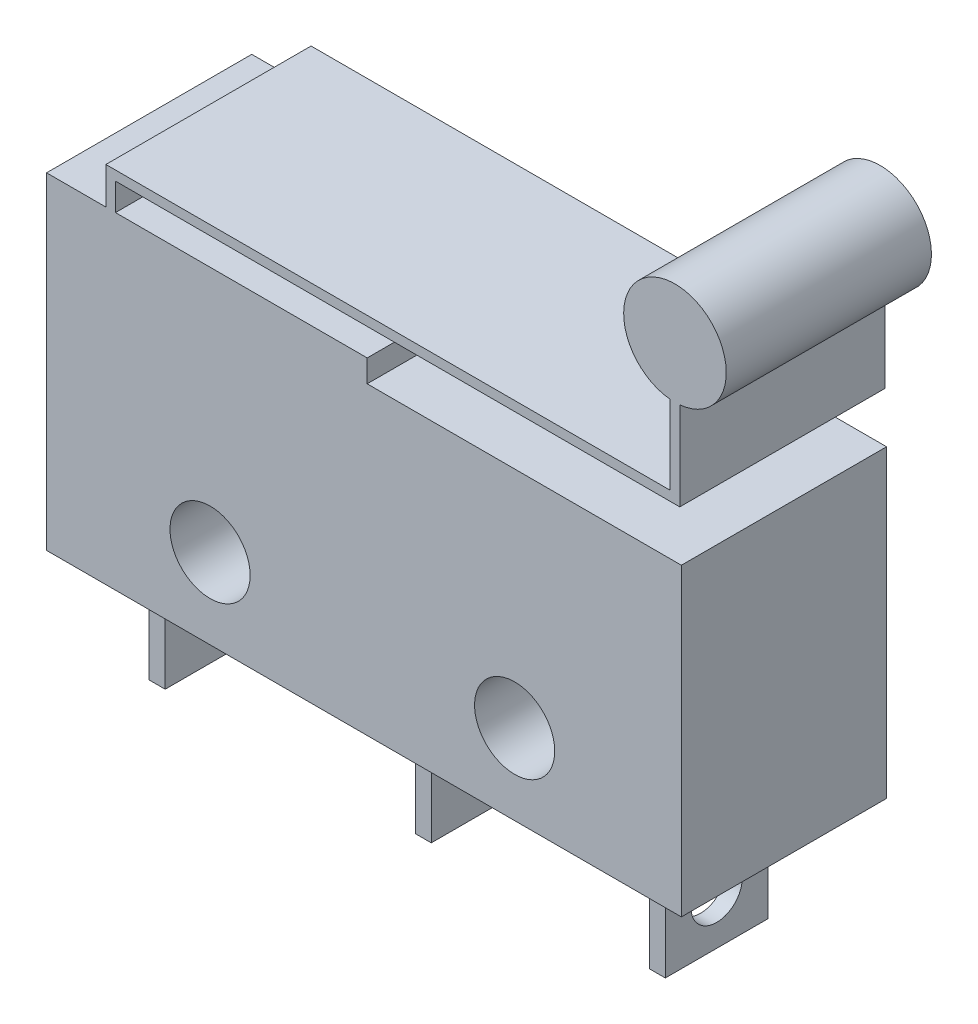
ISO-10303-21;
HEADER;
FILE_DESCRIPTION(('STEP AP214'),'2;1');
FILE_NAME('part.step','',(''),(''),'','','');
FILE_SCHEMA(('AUTOMOTIVE_DESIGN { 1 0 10303 214 1 1 1 1 }'));
ENDSEC;
DATA;
#1=APPLICATION_CONTEXT('core data for automotive mechanical design processes');
#2=APPLICATION_PROTOCOL_DEFINITION('international standard','automotive_design',2000,#1);
#3=PRODUCT_CONTEXT('',#1,'mechanical');
#4=PRODUCT('Part','Part','',(#3));
#5=PRODUCT_RELATED_PRODUCT_CATEGORY('part','',(#4));
#6=PRODUCT_DEFINITION_FORMATION('','',#4);
#7=PRODUCT_DEFINITION_CONTEXT('part definition',#1,'design');
#8=PRODUCT_DEFINITION('design','',#6,#7);
#9=PRODUCT_DEFINITION_SHAPE('','',#8);
#10=(LENGTH_UNIT() NAMED_UNIT(*) SI_UNIT(.MILLI.,.METRE.));
#11=(NAMED_UNIT(*) PLANE_ANGLE_UNIT() SI_UNIT($,.RADIAN.));
#12=(NAMED_UNIT(*) SI_UNIT($,.STERADIAN.) SOLID_ANGLE_UNIT());
#13=UNCERTAINTY_MEASURE_WITH_UNIT(LENGTH_MEASURE(1.E-05),#10,'distance_accuracy_value','');
#14=(GEOMETRIC_REPRESENTATION_CONTEXT(3) GLOBAL_UNCERTAINTY_ASSIGNED_CONTEXT((#13)) GLOBAL_UNIT_ASSIGNED_CONTEXT((#10,
#11,#12)) REPRESENTATION_CONTEXT('',''));
#15=CARTESIAN_POINT('',(0.,0.,0.));
#16=DIRECTION('',(0.,0.,1.));
#17=DIRECTION('',(1.,0.,0.));
#18=AXIS2_PLACEMENT_3D('',#15,#16,#17);
#19=CARTESIAN_POINT('',(0.,0.,6.4));
#20=DIRECTION('',(0.,1.,0.));
#21=DIRECTION('',(0.,0.,1.));
#22=AXIS2_PLACEMENT_3D('',#19,#20,#21);
#23=PLANE('',#22);
#24=DIRECTION('',(0.,0.,1.));
#25=VECTOR('',#24,1.);
#26=CARTESIAN_POINT('',(10.4,0.,4.8));
#27=LINE('',#26,#25);
#28=CARTESIAN_POINT('',(10.4,0.,1.6));
#29=VERTEX_POINT('',#28);
#30=CARTESIAN_POINT('',(10.4,0.,4.8));
#31=VERTEX_POINT('',#30);
#32=EDGE_CURVE('E238',#29,#31,#27,.T.);
#33=ORIENTED_EDGE('',*,*,#32,.F.);
#34=DIRECTION('',(1.,0.,0.));
#35=VECTOR('',#34,1.);
#36=CARTESIAN_POINT('',(9.9,0.,1.6));
#37=LINE('',#36,#35);
#38=CARTESIAN_POINT('',(9.9,0.,1.6));
#39=VERTEX_POINT('',#38);
#40=EDGE_CURVE('E254',#39,#29,#37,.T.);
#41=ORIENTED_EDGE('',*,*,#40,.F.);
#42=DIRECTION('',(0.,0.,-1.));
#43=VECTOR('',#42,1.);
#44=CARTESIAN_POINT('',(9.9,0.,4.8));
#45=LINE('',#44,#43);
#46=CARTESIAN_POINT('',(9.9,0.,4.8));
#47=VERTEX_POINT('',#46);
#48=EDGE_CURVE('E267',#47,#39,#45,.T.);
#49=ORIENTED_EDGE('',*,*,#48,.F.);
#50=DIRECTION('',(-1.,0.,0.));
#51=VECTOR('',#50,1.);
#52=CARTESIAN_POINT('',(9.9,0.,4.8));
#53=LINE('',#52,#51);
#54=EDGE_CURVE('E243',#31,#47,#53,.T.);
#55=ORIENTED_EDGE('',*,*,#54,.F.);
#56=EDGE_LOOP('',(#33,#41,#49,#55));
#57=FACE_BOUND('',#56,.T.);
#58=DIRECTION('',(1.,0.,0.));
#59=VECTOR('',#58,1.);
#60=CARTESIAN_POINT('',(0.,0.,0.));
#61=LINE('',#60,#59);
#62=CARTESIAN_POINT('',(0.,0.,0.));
#63=VERTEX_POINT('',#62);
#64=CARTESIAN_POINT('',(19.8,0.,0.));
#65=VERTEX_POINT('',#64);
#66=EDGE_CURVE('E433',#63,#65,#61,.T.);
#67=ORIENTED_EDGE('',*,*,#66,.T.);
#68=DIRECTION('',(0.,0.,-1.));
#69=VECTOR('',#68,1.);
#70=CARTESIAN_POINT('',(19.8,0.,6.4));
#71=LINE('',#70,#69);
#72=CARTESIAN_POINT('',(19.8,0.,6.4));
#73=VERTEX_POINT('',#72);
#74=EDGE_CURVE('E477',#73,#65,#71,.T.);
#75=ORIENTED_EDGE('',*,*,#74,.F.);
#76=DIRECTION('',(1.,0.,0.));
#77=VECTOR('',#76,1.);
#78=CARTESIAN_POINT('',(0.,0.,6.4));
#79=LINE('',#78,#77);
#80=CARTESIAN_POINT('',(0.,0.,6.4));
#81=VERTEX_POINT('',#80);
#82=EDGE_CURVE('E371',#81,#73,#79,.T.);
#83=ORIENTED_EDGE('',*,*,#82,.F.);
#84=DIRECTION('',(0.,0.,-1.));
#85=VECTOR('',#84,1.);
#86=CARTESIAN_POINT('',(0.,0.,6.4));
#87=LINE('',#86,#85);
#88=EDGE_CURVE('E481',#81,#63,#87,.T.);
#89=ORIENTED_EDGE('',*,*,#88,.T.);
#90=EDGE_LOOP('',(#67,#75,#83,#89));
#91=FACE_BOUND('',#90,.T.);
#92=DIRECTION('',(0.,0.,-1.));
#93=VECTOR('',#92,1.);
#94=CARTESIAN_POINT('',(1.6,0.,4.8));
#95=LINE('',#94,#93);
#96=CARTESIAN_POINT('',(1.6,0.,4.8));
#97=VERTEX_POINT('',#96);
#98=CARTESIAN_POINT('',(1.6,0.,1.6));
#99=VERTEX_POINT('',#98);
#100=EDGE_CURVE('E289',#97,#99,#95,.T.);
#101=ORIENTED_EDGE('',*,*,#100,.F.);
#102=DIRECTION('',(-1.,0.,0.));
#103=VECTOR('',#102,1.);
#104=CARTESIAN_POINT('',(2.1,0.,4.8));
#105=LINE('',#104,#103);
#106=CARTESIAN_POINT('',(2.1,0.,4.8));
#107=VERTEX_POINT('',#106);
#108=EDGE_CURVE('E295',#107,#97,#105,.T.);
#109=ORIENTED_EDGE('',*,*,#108,.F.);
#110=DIRECTION('',(0.,0.,1.));
#111=VECTOR('',#110,1.);
#112=CARTESIAN_POINT('',(2.1,0.,4.8));
#113=LINE('',#112,#111);
#114=CARTESIAN_POINT('',(2.1,0.,1.6));
#115=VERTEX_POINT('',#114);
#116=EDGE_CURVE('E312',#115,#107,#113,.T.);
#117=ORIENTED_EDGE('',*,*,#116,.F.);
#118=DIRECTION('',(1.,0.,0.));
#119=VECTOR('',#118,1.);
#120=CARTESIAN_POINT('',(2.1,0.,1.6));
#121=LINE('',#120,#119);
#122=EDGE_CURVE('E308',#99,#115,#121,.T.);
#123=ORIENTED_EDGE('',*,*,#122,.F.);
#124=EDGE_LOOP('',(#101,#109,#117,#123));
#125=FACE_BOUND('',#124,.T.);
#126=DIRECTION('',(0.,0.,-1.));
#127=VECTOR('',#126,1.);
#128=CARTESIAN_POINT('',(17.2,0.,4.79999999999999));
#129=LINE('',#128,#127);
#130=CARTESIAN_POINT('',(17.2,0.,4.79999999999999));
#131=VERTEX_POINT('',#130);
#132=CARTESIAN_POINT('',(17.2,0.,1.59999999999999));
#133=VERTEX_POINT('',#132);
#134=EDGE_CURVE('E236',#131,#133,#129,.T.);
#135=ORIENTED_EDGE('',*,*,#134,.F.);
#136=DIRECTION('',(-1.,0.,0.));
#137=VECTOR('',#136,1.);
#138=CARTESIAN_POINT('',(17.7,0.,4.79999999999999));
#139=LINE('',#138,#137);
#140=CARTESIAN_POINT('',(17.7,0.,4.79999999999999));
#141=VERTEX_POINT('',#140);
#142=EDGE_CURVE('E233',#141,#131,#139,.T.);
#143=ORIENTED_EDGE('',*,*,#142,.F.);
#144=DIRECTION('',(0.,0.,1.));
#145=VECTOR('',#144,1.);
#146=CARTESIAN_POINT('',(17.7,0.,4.79999999999999));
#147=LINE('',#146,#145);
#148=CARTESIAN_POINT('',(17.7,0.,1.59999999999999));
#149=VERTEX_POINT('',#148);
#150=EDGE_CURVE('E62',#149,#141,#147,.T.);
#151=ORIENTED_EDGE('',*,*,#150,.F.);
#152=DIRECTION('',(1.,0.,0.));
#153=VECTOR('',#152,1.);
#154=CARTESIAN_POINT('',(17.7,0.,1.59999999999999));
#155=LINE('',#154,#153);
#156=EDGE_CURVE('E57',#133,#149,#155,.T.);
#157=ORIENTED_EDGE('',*,*,#156,.F.);
#158=EDGE_LOOP('',(#135,#143,#151,#157));
#159=FACE_BOUND('',#158,.T.);
#160=ADVANCED_FACE('F41',(#57,#91,#125,#159),#23,.F.);
#161=CARTESIAN_POINT('',(19.75,0.,6.4));
#162=DIRECTION('',(1.,0.,0.));
#163=DIRECTION('',(0.,0.,-1.));
#164=AXIS2_PLACEMENT_3D('',#161,#162,#163);
#165=PLANE('',#164);
#166=DIRECTION('',(0.,-1.,0.));
#167=VECTOR('',#166,1.);
#168=CARTESIAN_POINT('',(19.75,0.,0.));
#169=LINE('',#168,#167);
#170=CARTESIAN_POINT('',(19.75,13.8070467677926,0.));
#171=VERTEX_POINT('',#170);
#172=CARTESIAN_POINT('',(19.75,11.05,0.));
#173=VERTEX_POINT('',#172);
#174=EDGE_CURVE('E405',#171,#173,#169,.T.);
#175=ORIENTED_EDGE('',*,*,#174,.F.);
#176=DIRECTION('',(0.,0.,-1.));
#177=VECTOR('',#176,1.);
#178=CARTESIAN_POINT('',(19.75,13.8070467677926,6.4));
#179=LINE('',#178,#177);
#180=CARTESIAN_POINT('',(19.75,13.8070467677926,6.4));
#181=VERTEX_POINT('',#180);
#182=EDGE_CURVE('E11',#181,#171,#179,.T.);
#183=ORIENTED_EDGE('',*,*,#182,.F.);
#184=DIRECTION('',(0.,-1.,0.));
#185=VECTOR('',#184,1.);
#186=CARTESIAN_POINT('',(19.75,0.,6.4));
#187=LINE('',#186,#185);
#188=CARTESIAN_POINT('',(19.75,11.05,6.4));
#189=VERTEX_POINT('',#188);
#190=EDGE_CURVE('E344',#181,#189,#187,.T.);
#191=ORIENTED_EDGE('',*,*,#190,.T.);
#192=DIRECTION('',(0.,0.,-1.));
#193=VECTOR('',#192,1.);
#194=CARTESIAN_POINT('',(19.75,11.05,6.4));
#195=LINE('',#194,#193);
#196=EDGE_CURVE('E397',#189,#173,#195,.T.);
#197=ORIENTED_EDGE('',*,*,#196,.T.);
#198=EDGE_LOOP('',(#175,#183,#191,#197));
#199=FACE_BOUND('',#198,.T.);
#200=ADVANCED_FACE('F512',(#199),#165,.T.);
#201=CARTESIAN_POINT('',(19.6,15.4,6.4));
#202=DIRECTION('',(0.,0.,-1.));
#203=DIRECTION('',(-1.,0.,0.));
#204=AXIS2_PLACEMENT_3D('',#201,#202,#203);
#205=CYLINDRICAL_SURFACE('',#204,1.6);
#206=CARTESIAN_POINT('',(19.6,15.4,0.));
#207=DIRECTION('',(0.,0.,1.));
#208=DIRECTION('',(1.,0.,0.));
#209=AXIS2_PLACEMENT_3D('',#206,#207,#208);
#210=CIRCLE('',#209,1.6);
#211=CARTESIAN_POINT('',(19.45,13.8070467677926,0.));
#212=VERTEX_POINT('',#211);
#213=EDGE_CURVE('E409',#171,#212,#210,.T.);
#214=ORIENTED_EDGE('',*,*,#213,.T.);
#215=DIRECTION('',(0.,0.,-1.));
#216=VECTOR('',#215,1.);
#217=CARTESIAN_POINT('',(19.45,13.8070467677926,6.4));
#218=LINE('',#217,#216);
#219=CARTESIAN_POINT('',(19.45,13.8070467677926,6.4));
#220=VERTEX_POINT('',#219);
#221=EDGE_CURVE('E50',#220,#212,#218,.T.);
#222=ORIENTED_EDGE('',*,*,#221,.F.);
#223=CARTESIAN_POINT('',(19.6,15.4,6.4));
#224=DIRECTION('',(0.,0.,1.));
#225=DIRECTION('',(1.,0.,0.));
#226=AXIS2_PLACEMENT_3D('',#223,#224,#225);
#227=CIRCLE('',#226,1.6);
#228=EDGE_CURVE('E348',#181,#220,#227,.T.);
#229=ORIENTED_EDGE('',*,*,#228,.F.);
#230=ORIENTED_EDGE('',*,*,#182,.T.);
#231=EDGE_LOOP('',(#214,#222,#229,#230));
#232=FACE_BOUND('',#231,.T.);
#233=ADVANCED_FACE('F506',(#232),#205,.T.);
#234=CARTESIAN_POINT('',(19.45,0.,6.4));
#235=DIRECTION('',(1.,0.,0.));
#236=DIRECTION('',(0.,0.,-1.));
#237=AXIS2_PLACEMENT_3D('',#234,#235,#236);
#238=PLANE('',#237);
#239=DIRECTION('',(0.,-1.,0.));
#240=VECTOR('',#239,1.);
#241=CARTESIAN_POINT('',(19.45,0.,0.));
#242=LINE('',#241,#240);
#243=CARTESIAN_POINT('',(19.45,11.35,0.));
#244=VERTEX_POINT('',#243);
#245=EDGE_CURVE('E413',#212,#244,#242,.T.);
#246=ORIENTED_EDGE('',*,*,#245,.T.);
#247=DIRECTION('',(0.,0.,-1.));
#248=VECTOR('',#247,1.);
#249=CARTESIAN_POINT('',(19.45,11.35,6.4));
#250=LINE('',#249,#248);
#251=CARTESIAN_POINT('',(19.45,11.35,6.4));
#252=VERTEX_POINT('',#251);
#253=EDGE_CURVE('E494',#252,#244,#250,.T.);
#254=ORIENTED_EDGE('',*,*,#253,.F.);
#255=DIRECTION('',(0.,-1.,0.));
#256=VECTOR('',#255,1.);
#257=CARTESIAN_POINT('',(19.45,0.,6.4));
#258=LINE('',#257,#256);
#259=EDGE_CURVE('E352',#220,#252,#258,.T.);
#260=ORIENTED_EDGE('',*,*,#259,.F.);
#261=ORIENTED_EDGE('',*,*,#221,.T.);
#262=EDGE_LOOP('',(#246,#254,#260,#261));
#263=FACE_BOUND('',#262,.T.);
#264=ADVANCED_FACE('F501',(#263),#238,.F.);
#265=CARTESIAN_POINT('',(0.,11.35,6.4));
#266=DIRECTION('',(0.,-1.,0.));
#267=DIRECTION('',(1.,0.,0.));
#268=AXIS2_PLACEMENT_3D('',#265,#266,#267);
#269=PLANE('',#268);
#270=DIRECTION('',(-1.,0.,0.));
#271=VECTOR('',#270,1.);
#272=CARTESIAN_POINT('',(0.,11.35,0.));
#273=LINE('',#272,#271);
#274=CARTESIAN_POINT('',(1.85,11.35,0.));
#275=VERTEX_POINT('',#274);
#276=EDGE_CURVE('E417',#244,#275,#273,.T.);
#277=ORIENTED_EDGE('',*,*,#276,.T.);
#278=DIRECTION('',(0.,0.,-1.));
#279=VECTOR('',#278,1.);
#280=CARTESIAN_POINT('',(1.85,11.35,6.4));
#281=LINE('',#280,#279);
#282=CARTESIAN_POINT('',(1.85,11.35,6.4));
#283=VERTEX_POINT('',#282);
#284=EDGE_CURVE('E490',#283,#275,#281,.T.);
#285=ORIENTED_EDGE('',*,*,#284,.F.);
#286=DIRECTION('',(-1.,0.,0.));
#287=VECTOR('',#286,1.);
#288=CARTESIAN_POINT('',(0.,11.35,6.4));
#289=LINE('',#288,#287);
#290=EDGE_CURVE('E356',#252,#283,#289,.T.);
#291=ORIENTED_EDGE('',*,*,#290,.F.);
#292=ORIENTED_EDGE('',*,*,#253,.T.);
#293=EDGE_LOOP('',(#277,#285,#291,#292));
#294=FACE_BOUND('',#293,.T.);
#295=ADVANCED_FACE('F554',(#294),#269,.F.);
#296=CARTESIAN_POINT('',(1.85,0.,6.4));
#297=DIRECTION('',(1.,0.,0.));
#298=DIRECTION('',(0.,0.,-1.));
#299=AXIS2_PLACEMENT_3D('',#296,#297,#298);
#300=PLANE('',#299);
#301=DIRECTION('',(0.,-1.,0.));
#302=VECTOR('',#301,1.);
#303=CARTESIAN_POINT('',(1.85,0.,0.));
#304=LINE('',#303,#302);
#305=CARTESIAN_POINT('',(1.85,10.2,0.));
#306=VERTEX_POINT('',#305);
#307=EDGE_CURVE('E421',#275,#306,#304,.T.);
#308=ORIENTED_EDGE('',*,*,#307,.T.);
#309=DIRECTION('',(0.,0.,-1.));
#310=VECTOR('',#309,1.);
#311=CARTESIAN_POINT('',(1.85,10.2,6.4));
#312=LINE('',#311,#310);
#313=CARTESIAN_POINT('',(1.85,10.2,6.4));
#314=VERTEX_POINT('',#313);
#315=EDGE_CURVE('E487',#314,#306,#312,.T.);
#316=ORIENTED_EDGE('',*,*,#315,.F.);
#317=DIRECTION('',(0.,-1.,0.));
#318=VECTOR('',#317,1.);
#319=CARTESIAN_POINT('',(1.85,0.,6.4));
#320=LINE('',#319,#318);
#321=EDGE_CURVE('E360',#283,#314,#320,.T.);
#322=ORIENTED_EDGE('',*,*,#321,.F.);
#323=ORIENTED_EDGE('',*,*,#284,.T.);
#324=EDGE_LOOP('',(#308,#316,#322,#323));
#325=FACE_BOUND('',#324,.T.);
#326=ADVANCED_FACE('F552',(#325),#300,.F.);
#327=CARTESIAN_POINT('',(0.,10.2,6.4));
#328=DIRECTION('',(0.,1.,0.));
#329=DIRECTION('',(-1.,0.,0.));
#330=AXIS2_PLACEMENT_3D('',#327,#328,#329);
#331=PLANE('',#330);
#332=DIRECTION('',(1.,0.,0.));
#333=VECTOR('',#332,1.);
#334=CARTESIAN_POINT('',(0.,10.2,0.));
#335=LINE('',#334,#333);
#336=CARTESIAN_POINT('',(0.,10.2,0.));
#337=VERTEX_POINT('',#336);
#338=EDGE_CURVE('E425',#337,#306,#335,.T.);
#339=ORIENTED_EDGE('',*,*,#338,.F.);
#340=DIRECTION('',(0.,0.,-1.));
#341=VECTOR('',#340,1.);
#342=CARTESIAN_POINT('',(0.,10.2,6.4));
#343=LINE('',#342,#341);
#344=CARTESIAN_POINT('',(0.,10.2,6.4));
#345=VERTEX_POINT('',#344);
#346=EDGE_CURVE('E484',#345,#337,#343,.T.);
#347=ORIENTED_EDGE('',*,*,#346,.F.);
#348=DIRECTION('',(1.,0.,0.));
#349=VECTOR('',#348,1.);
#350=CARTESIAN_POINT('',(0.,10.2,6.4));
#351=LINE('',#350,#349);
#352=EDGE_CURVE('E363',#345,#314,#351,.T.);
#353=ORIENTED_EDGE('',*,*,#352,.T.);
#354=ORIENTED_EDGE('',*,*,#315,.T.);
#355=EDGE_LOOP('',(#339,#347,#353,#354));
#356=FACE_BOUND('',#355,.T.);
#357=ADVANCED_FACE('F548',(#356),#331,.T.);
#358=CARTESIAN_POINT('',(0.,0.,6.4));
#359=DIRECTION('',(-1.,0.,0.));
#360=DIRECTION('',(0.,0.,1.));
#361=AXIS2_PLACEMENT_3D('',#358,#359,#360);
#362=PLANE('',#361);
#363=DIRECTION('',(0.,1.,0.));
#364=VECTOR('',#363,1.);
#365=CARTESIAN_POINT('',(0.,0.,0.));
#366=LINE('',#365,#364);
#367=EDGE_CURVE('E429',#63,#337,#366,.T.);
#368=ORIENTED_EDGE('',*,*,#367,.F.);
#369=ORIENTED_EDGE('',*,*,#88,.F.);
#370=DIRECTION('',(0.,1.,0.));
#371=VECTOR('',#370,1.);
#372=CARTESIAN_POINT('',(0.,0.,6.4));
#373=LINE('',#372,#371);
#374=EDGE_CURVE('E367',#81,#345,#373,.T.);
#375=ORIENTED_EDGE('',*,*,#374,.T.);
#376=ORIENTED_EDGE('',*,*,#346,.T.);
#377=EDGE_LOOP('',(#368,#369,#375,#376));
#378=FACE_BOUND('',#377,.T.);
#379=ADVANCED_FACE('F542',(#378),#362,.T.);
#380=CARTESIAN_POINT('',(19.8,0.,6.4));
#381=DIRECTION('',(-1.,0.,0.));
#382=DIRECTION('',(0.,0.,1.));
#383=AXIS2_PLACEMENT_3D('',#380,#381,#382);
#384=PLANE('',#383);
#385=DIRECTION('',(0.,1.,0.));
#386=VECTOR('',#385,1.);
#387=CARTESIAN_POINT('',(19.8,0.,0.));
#388=LINE('',#387,#386);
#389=CARTESIAN_POINT('',(19.8,9.5,0.));
#390=VERTEX_POINT('',#389);
#391=EDGE_CURVE('E437',#65,#390,#388,.T.);
#392=ORIENTED_EDGE('',*,*,#391,.T.);
#393=DIRECTION('',(0.,0.,-1.));
#394=VECTOR('',#393,1.);
#395=CARTESIAN_POINT('',(19.8,9.5,6.4));
#396=LINE('',#395,#394);
#397=CARTESIAN_POINT('',(19.8,9.5,6.4));
#398=VERTEX_POINT('',#397);
#399=EDGE_CURVE('E474',#398,#390,#396,.T.);
#400=ORIENTED_EDGE('',*,*,#399,.F.);
#401=DIRECTION('',(0.,1.,0.));
#402=VECTOR('',#401,1.);
#403=CARTESIAN_POINT('',(19.8,0.,6.4));
#404=LINE('',#403,#402);
#405=EDGE_CURVE('E375',#73,#398,#404,.T.);
#406=ORIENTED_EDGE('',*,*,#405,.F.);
#407=ORIENTED_EDGE('',*,*,#74,.T.);
#408=EDGE_LOOP('',(#392,#400,#406,#407));
#409=FACE_BOUND('',#408,.T.);
#410=ADVANCED_FACE('F536',(#409),#384,.F.);
#411=CARTESIAN_POINT('',(0.,9.5,6.4));
#412=DIRECTION('',(0.,1.,0.));
#413=DIRECTION('',(0.,0.,1.));
#414=AXIS2_PLACEMENT_3D('',#411,#412,#413);
#415=PLANE('',#414);
#416=DIRECTION('',(1.,0.,0.));
#417=VECTOR('',#416,1.);
#418=CARTESIAN_POINT('',(0.,9.5,0.));
#419=LINE('',#418,#417);
#420=CARTESIAN_POINT('',(10.,9.5,0.));
#421=VERTEX_POINT('',#420);
#422=EDGE_CURVE('E441',#421,#390,#419,.T.);
#423=ORIENTED_EDGE('',*,*,#422,.F.);
#424=DIRECTION('',(0.,0.,-1.));
#425=VECTOR('',#424,1.);
#426=CARTESIAN_POINT('',(10.,9.5,6.4));
#427=LINE('',#426,#425);
#428=CARTESIAN_POINT('',(10.,9.5,6.4));
#429=VERTEX_POINT('',#428);
#430=EDGE_CURVE('E471',#429,#421,#427,.T.);
#431=ORIENTED_EDGE('',*,*,#430,.F.);
#432=DIRECTION('',(1.,0.,0.));
#433=VECTOR('',#432,1.);
#434=CARTESIAN_POINT('',(0.,9.5,6.4));
#435=LINE('',#434,#433);
#436=EDGE_CURVE('E378',#429,#398,#435,.T.);
#437=ORIENTED_EDGE('',*,*,#436,.T.);
#438=ORIENTED_EDGE('',*,*,#399,.T.);
#439=EDGE_LOOP('',(#423,#431,#437,#438));
#440=FACE_BOUND('',#439,.T.);
#441=ADVANCED_FACE('F532',(#440),#415,.T.);
#442=CARTESIAN_POINT('',(10.,0.,6.4));
#443=DIRECTION('',(-1.,0.,0.));
#444=DIRECTION('',(0.,0.,1.));
#445=AXIS2_PLACEMENT_3D('',#442,#443,#444);
#446=PLANE('',#445);
#447=DIRECTION('',(0.,1.,0.));
#448=VECTOR('',#447,1.);
#449=CARTESIAN_POINT('',(10.,0.,0.));
#450=LINE('',#449,#448);
#451=CARTESIAN_POINT('',(10.,10.2,0.));
#452=VERTEX_POINT('',#451);
#453=EDGE_CURVE('E445',#421,#452,#450,.T.);
#454=ORIENTED_EDGE('',*,*,#453,.T.);
#455=DIRECTION('',(0.,0.,-1.));
#456=VECTOR('',#455,1.);
#457=CARTESIAN_POINT('',(10.,10.2,6.4));
#458=LINE('',#457,#456);
#459=CARTESIAN_POINT('',(10.,10.2,6.4));
#460=VERTEX_POINT('',#459);
#461=EDGE_CURVE('E468',#460,#452,#458,.T.);
#462=ORIENTED_EDGE('',*,*,#461,.F.);
#463=DIRECTION('',(0.,1.,0.));
#464=VECTOR('',#463,1.);
#465=CARTESIAN_POINT('',(10.,0.,6.4));
#466=LINE('',#465,#464);
#467=EDGE_CURVE('E382',#429,#460,#466,.T.);
#468=ORIENTED_EDGE('',*,*,#467,.F.);
#469=ORIENTED_EDGE('',*,*,#430,.T.);
#470=EDGE_LOOP('',(#454,#462,#468,#469));
#471=FACE_BOUND('',#470,.T.);
#472=ADVANCED_FACE('F529',(#471),#446,.F.);
#473=CARTESIAN_POINT('',(0.,10.2,6.4));
#474=DIRECTION('',(0.,1.,0.));
#475=DIRECTION('',(-1.,0.,0.));
#476=AXIS2_PLACEMENT_3D('',#473,#474,#475);
#477=PLANE('',#476);
#478=DIRECTION('',(1.,0.,0.));
#479=VECTOR('',#478,1.);
#480=CARTESIAN_POINT('',(0.,10.2,0.));
#481=LINE('',#480,#479);
#482=CARTESIAN_POINT('',(2.15,10.2,0.));
#483=VERTEX_POINT('',#482);
#484=EDGE_CURVE('E449',#483,#452,#481,.T.);
#485=ORIENTED_EDGE('',*,*,#484,.F.);
#486=DIRECTION('',(0.,0.,-1.));
#487=VECTOR('',#486,1.);
#488=CARTESIAN_POINT('',(2.15,10.2,6.4));
#489=LINE('',#488,#487);
#490=CARTESIAN_POINT('',(2.15,10.2,6.4));
#491=VERTEX_POINT('',#490);
#492=EDGE_CURVE('E465',#491,#483,#489,.T.);
#493=ORIENTED_EDGE('',*,*,#492,.F.);
#494=DIRECTION('',(1.,0.,0.));
#495=VECTOR('',#494,1.);
#496=CARTESIAN_POINT('',(0.,10.2,6.4));
#497=LINE('',#496,#495);
#498=EDGE_CURVE('E385',#491,#460,#497,.T.);
#499=ORIENTED_EDGE('',*,*,#498,.T.);
#500=ORIENTED_EDGE('',*,*,#461,.T.);
#501=EDGE_LOOP('',(#485,#493,#499,#500));
#502=FACE_BOUND('',#501,.T.);
#503=ADVANCED_FACE('F525',(#502),#477,.T.);
#504=CARTESIAN_POINT('',(2.15,0.,6.4));
#505=DIRECTION('',(1.,0.,0.));
#506=DIRECTION('',(0.,0.,-1.));
#507=AXIS2_PLACEMENT_3D('',#504,#505,#506);
#508=PLANE('',#507);
#509=DIRECTION('',(0.,-1.,0.));
#510=VECTOR('',#509,1.);
#511=CARTESIAN_POINT('',(2.15,0.,0.));
#512=LINE('',#511,#510);
#513=CARTESIAN_POINT('',(2.15,11.05,0.));
#514=VERTEX_POINT('',#513);
#515=EDGE_CURVE('E453',#514,#483,#512,.T.);
#516=ORIENTED_EDGE('',*,*,#515,.F.);
#517=DIRECTION('',(0.,0.,-1.));
#518=VECTOR('',#517,1.);
#519=CARTESIAN_POINT('',(2.15,11.05,6.4));
#520=LINE('',#519,#518);
#521=CARTESIAN_POINT('',(2.15,11.05,6.4));
#522=VERTEX_POINT('',#521);
#523=EDGE_CURVE('E462',#522,#514,#520,.T.);
#524=ORIENTED_EDGE('',*,*,#523,.F.);
#525=DIRECTION('',(0.,-1.,0.));
#526=VECTOR('',#525,1.);
#527=CARTESIAN_POINT('',(2.15,0.,6.4));
#528=LINE('',#527,#526);
#529=EDGE_CURVE('E389',#522,#491,#528,.T.);
#530=ORIENTED_EDGE('',*,*,#529,.T.);
#531=ORIENTED_EDGE('',*,*,#492,.T.);
#532=EDGE_LOOP('',(#516,#524,#530,#531));
#533=FACE_BOUND('',#532,.T.);
#534=ADVANCED_FACE('F521',(#533),#508,.T.);
#535=CARTESIAN_POINT('',(5.1,2.5,6.4));
#536=DIRECTION('',(0.,0.,-1.));
#537=DIRECTION('',(-1.,0.,0.));
#538=AXIS2_PLACEMENT_3D('',#535,#536,#537);
#539=CYLINDRICAL_SURFACE('',#538,1.25);
#540=CARTESIAN_POINT('',(5.1,2.5,6.4));
#541=DIRECTION('',(0.,0.,1.));
#542=DIRECTION('',(1.,0.,0.));
#543=AXIS2_PLACEMENT_3D('',#540,#541,#542);
#544=CIRCLE('',#543,1.25);
#545=CARTESIAN_POINT('',(6.35,2.5,6.4));
#546=VERTEX_POINT('',#545);
#547=EDGE_CURVE('E339',#546,#546,#544,.T.);
#548=ORIENTED_EDGE('',*,*,#547,.T.);
#549=EDGE_LOOP('',(#548));
#550=FACE_BOUND('',#549,.T.);
#551=CARTESIAN_POINT('',(5.1,2.5,0.));
#552=DIRECTION('',(0.,0.,1.));
#553=DIRECTION('',(1.,0.,0.));
#554=AXIS2_PLACEMENT_3D('',#551,#552,#553);
#555=CIRCLE('',#554,1.25);
#556=CARTESIAN_POINT('',(6.35,2.5,0.));
#557=VERTEX_POINT('',#556);
#558=EDGE_CURVE('E401',#557,#557,#555,.T.);
#559=ORIENTED_EDGE('',*,*,#558,.F.);
#560=EDGE_LOOP('',(#559));
#561=FACE_BOUND('',#560,.T.);
#562=ADVANCED_FACE('F676',(#550,#561),#539,.F.);
#563=CARTESIAN_POINT('',(14.6,2.5,6.4));
#564=DIRECTION('',(0.,0.,-1.));
#565=DIRECTION('',(-1.,0.,0.));
#566=AXIS2_PLACEMENT_3D('',#563,#564,#565);
#567=CYLINDRICAL_SURFACE('',#566,1.25);
#568=CARTESIAN_POINT('',(14.6,2.5,6.4));
#569=DIRECTION('',(0.,0.,1.));
#570=DIRECTION('',(1.,0.,0.));
#571=AXIS2_PLACEMENT_3D('',#568,#569,#570);
#572=CIRCLE('',#571,1.25);
#573=CARTESIAN_POINT('',(15.85,2.5,6.4));
#574=VERTEX_POINT('',#573);
#575=EDGE_CURVE('E335',#574,#574,#572,.T.);
#576=ORIENTED_EDGE('',*,*,#575,.T.);
#577=EDGE_LOOP('',(#576));
#578=FACE_BOUND('',#577,.T.);
#579=CARTESIAN_POINT('',(14.6,2.5,0.));
#580=DIRECTION('',(0.,0.,1.));
#581=DIRECTION('',(1.,0.,0.));
#582=AXIS2_PLACEMENT_3D('',#579,#580,#581);
#583=CIRCLE('',#582,1.25);
#584=CARTESIAN_POINT('',(15.85,2.5,0.));
#585=VERTEX_POINT('',#584);
#586=EDGE_CURVE('E334',#585,#585,#583,.T.);
#587=ORIENTED_EDGE('',*,*,#586,.F.);
#588=EDGE_LOOP('',(#587));
#589=FACE_BOUND('',#588,.T.);
#590=ADVANCED_FACE('F43',(#578,#589),#567,.F.);
#591=CARTESIAN_POINT('',(0.,11.05,6.4));
#592=DIRECTION('',(0.,-1.,0.));
#593=DIRECTION('',(1.,0.,0.));
#594=AXIS2_PLACEMENT_3D('',#591,#592,#593);
#595=PLANE('',#594);
#596=DIRECTION('',(-1.,0.,0.));
#597=VECTOR('',#596,1.);
#598=CARTESIAN_POINT('',(0.,11.05,0.));
#599=LINE('',#598,#597);
#600=EDGE_CURVE('E340',#173,#514,#599,.T.);
#601=ORIENTED_EDGE('',*,*,#600,.F.);
#602=ORIENTED_EDGE('',*,*,#196,.F.);
#603=DIRECTION('',(-1.,0.,0.));
#604=VECTOR('',#603,1.);
#605=CARTESIAN_POINT('',(0.,11.05,6.4));
#606=LINE('',#605,#604);
#607=EDGE_CURVE('E393',#189,#522,#606,.T.);
#608=ORIENTED_EDGE('',*,*,#607,.T.);
#609=ORIENTED_EDGE('',*,*,#523,.T.);
#610=EDGE_LOOP('',(#601,#602,#608,#609));
#611=FACE_BOUND('',#610,.T.);
#612=ADVANCED_FACE('F516',(#611),#595,.T.);
#613=CARTESIAN_POINT('',(0.,0.,6.4));
#614=DIRECTION('',(0.,0.,1.));
#615=DIRECTION('',(1.,0.,0.));
#616=AXIS2_PLACEMENT_3D('',#613,#614,#615);
#617=PLANE('',#616);
#618=ORIENTED_EDGE('',*,*,#575,.F.);
#619=EDGE_LOOP('',(#618));
#620=FACE_BOUND('',#619,.T.);
#621=ORIENTED_EDGE('',*,*,#547,.F.);
#622=EDGE_LOOP('',(#621));
#623=FACE_BOUND('',#622,.T.);
#624=ORIENTED_EDGE('',*,*,#190,.F.);
#625=ORIENTED_EDGE('',*,*,#228,.T.);
#626=ORIENTED_EDGE('',*,*,#259,.T.);
#627=ORIENTED_EDGE('',*,*,#290,.T.);
#628=ORIENTED_EDGE('',*,*,#321,.T.);
#629=ORIENTED_EDGE('',*,*,#352,.F.);
#630=ORIENTED_EDGE('',*,*,#374,.F.);
#631=ORIENTED_EDGE('',*,*,#82,.T.);
#632=ORIENTED_EDGE('',*,*,#405,.T.);
#633=ORIENTED_EDGE('',*,*,#436,.F.);
#634=ORIENTED_EDGE('',*,*,#467,.T.);
#635=ORIENTED_EDGE('',*,*,#498,.F.);
#636=ORIENTED_EDGE('',*,*,#529,.F.);
#637=ORIENTED_EDGE('',*,*,#607,.F.);
#638=EDGE_LOOP('',(#624,#625,#626,#627,#628,#629,#630,#631,#632,#633,#634,#635,#636,#637));
#639=FACE_BOUND('',#638,.T.);
#640=ADVANCED_FACE('F556',(#620,#623,#639),#617,.T.);
#641=CARTESIAN_POINT('',(0.,0.,0.));
#642=DIRECTION('',(0.,0.,1.));
#643=DIRECTION('',(1.,0.,0.));
#644=AXIS2_PLACEMENT_3D('',#641,#642,#643);
#645=PLANE('',#644);
#646=ORIENTED_EDGE('',*,*,#586,.T.);
#647=EDGE_LOOP('',(#646));
#648=FACE_BOUND('',#647,.T.);
#649=ORIENTED_EDGE('',*,*,#558,.T.);
#650=EDGE_LOOP('',(#649));
#651=FACE_BOUND('',#650,.T.);
#652=ORIENTED_EDGE('',*,*,#174,.T.);
#653=ORIENTED_EDGE('',*,*,#600,.T.);
#654=ORIENTED_EDGE('',*,*,#515,.T.);
#655=ORIENTED_EDGE('',*,*,#484,.T.);
#656=ORIENTED_EDGE('',*,*,#453,.F.);
#657=ORIENTED_EDGE('',*,*,#422,.T.);
#658=ORIENTED_EDGE('',*,*,#391,.F.);
#659=ORIENTED_EDGE('',*,*,#66,.F.);
#660=ORIENTED_EDGE('',*,*,#367,.T.);
#661=ORIENTED_EDGE('',*,*,#338,.T.);
#662=ORIENTED_EDGE('',*,*,#307,.F.);
#663=ORIENTED_EDGE('',*,*,#276,.F.);
#664=ORIENTED_EDGE('',*,*,#245,.F.);
#665=ORIENTED_EDGE('',*,*,#213,.F.);
#666=EDGE_LOOP('',(#652,#653,#654,#655,#656,#657,#658,#659,#660,#661,#662,#663,#664,#665));
#667=FACE_BOUND('',#666,.T.);
#668=ADVANCED_FACE('F509',(#648,#651,#667),#645,.F.);
#669=CARTESIAN_POINT('',(1.6,-3.5,4.8));
#670=DIRECTION('',(1.,0.,0.));
#671=DIRECTION('',(0.,0.,-1.));
#672=AXIS2_PLACEMENT_3D('',#669,#670,#671);
#673=PLANE('',#672);
#674=CARTESIAN_POINT('',(1.6,-2.,3.19999999999999));
#675=DIRECTION('',(1.,0.,0.));
#676=DIRECTION('',(0.,0.,-1.));
#677=AXIS2_PLACEMENT_3D('',#674,#675,#676);
#678=CIRCLE('',#677,0.8);
#679=CARTESIAN_POINT('',(1.6,-2.,2.39999999999999));
#680=VERTEX_POINT('',#679);
#681=EDGE_CURVE('E599',#680,#680,#678,.F.);
#682=ORIENTED_EDGE('',*,*,#681,.F.);
#683=EDGE_LOOP('',(#682));
#684=FACE_BOUND('',#683,.T.);
#685=ORIENTED_EDGE('',*,*,#100,.T.);
#686=DIRECTION('',(0.,1.,0.));
#687=VECTOR('',#686,1.);
#688=CARTESIAN_POINT('',(1.6,-3.5,1.6));
#689=LINE('',#688,#687);
#690=CARTESIAN_POINT('',(1.6,-3.5,1.6));
#691=VERTEX_POINT('',#690);
#692=EDGE_CURVE('E330',#691,#99,#689,.T.);
#693=ORIENTED_EDGE('',*,*,#692,.F.);
#694=DIRECTION('',(0.,0.,-1.));
#695=VECTOR('',#694,1.);
#696=CARTESIAN_POINT('',(1.6,-3.5,4.8));
#697=LINE('',#696,#695);
#698=CARTESIAN_POINT('',(1.6,-3.5,4.8));
#699=VERTEX_POINT('',#698);
#700=EDGE_CURVE('E290',#699,#691,#697,.T.);
#701=ORIENTED_EDGE('',*,*,#700,.F.);
#702=DIRECTION('',(0.,1.,0.));
#703=VECTOR('',#702,1.);
#704=CARTESIAN_POINT('',(1.6,-3.5,4.8));
#705=LINE('',#704,#703);
#706=EDGE_CURVE('E304',#699,#97,#705,.T.);
#707=ORIENTED_EDGE('',*,*,#706,.T.);
#708=EDGE_LOOP('',(#685,#693,#701,#707));
#709=FACE_BOUND('',#708,.T.);
#710=ADVANCED_FACE('F661',(#684,#709),#673,.F.);
#711=CARTESIAN_POINT('',(2.1,-3.5,1.6));
#712=DIRECTION('',(0.,0.,1.));
#713=DIRECTION('',(1.,0.,0.));
#714=AXIS2_PLACEMENT_3D('',#711,#712,#713);
#715=PLANE('',#714);
#716=ORIENTED_EDGE('',*,*,#122,.T.);
#717=DIRECTION('',(0.,1.,0.));
#718=VECTOR('',#717,1.);
#719=CARTESIAN_POINT('',(2.1,-3.5,1.6));
#720=LINE('',#719,#718);
#721=CARTESIAN_POINT('',(2.1,-3.5,1.6));
#722=VERTEX_POINT('',#721);
#723=EDGE_CURVE('E326',#722,#115,#720,.T.);
#724=ORIENTED_EDGE('',*,*,#723,.F.);
#725=DIRECTION('',(1.,0.,0.));
#726=VECTOR('',#725,1.);
#727=CARTESIAN_POINT('',(2.1,-3.5,1.6));
#728=LINE('',#727,#726);
#729=EDGE_CURVE('E294',#691,#722,#728,.T.);
#730=ORIENTED_EDGE('',*,*,#729,.F.);
#731=ORIENTED_EDGE('',*,*,#692,.T.);
#732=EDGE_LOOP('',(#716,#724,#730,#731));
#733=FACE_BOUND('',#732,.T.);
#734=ADVANCED_FACE('F657',(#733),#715,.F.);
#735=CARTESIAN_POINT('',(2.1,-3.5,4.8));
#736=DIRECTION('',(-1.,0.,0.));
#737=DIRECTION('',(0.,0.,1.));
#738=AXIS2_PLACEMENT_3D('',#735,#736,#737);
#739=PLANE('',#738);
#740=CARTESIAN_POINT('',(2.1,-2.,3.19999999999999));
#741=DIRECTION('',(-1.,0.,0.));
#742=DIRECTION('',(0.,0.,1.));
#743=AXIS2_PLACEMENT_3D('',#740,#741,#742);
#744=CIRCLE('',#743,0.8);
#745=CARTESIAN_POINT('',(2.1,-2.,3.99999999999999));
#746=VERTEX_POINT('',#745);
#747=EDGE_CURVE('E563',#746,#746,#744,.T.);
#748=ORIENTED_EDGE('',*,*,#747,.T.);
#749=EDGE_LOOP('',(#748));
#750=FACE_BOUND('',#749,.T.);
#751=ORIENTED_EDGE('',*,*,#116,.T.);
#752=DIRECTION('',(0.,1.,0.));
#753=VECTOR('',#752,1.);
#754=CARTESIAN_POINT('',(2.1,-3.5,4.8));
#755=LINE('',#754,#753);
#756=CARTESIAN_POINT('',(2.1,-3.5,4.8));
#757=VERTEX_POINT('',#756);
#758=EDGE_CURVE('E322',#757,#107,#755,.T.);
#759=ORIENTED_EDGE('',*,*,#758,.F.);
#760=DIRECTION('',(0.,0.,1.));
#761=VECTOR('',#760,1.);
#762=CARTESIAN_POINT('',(2.1,-3.5,4.8));
#763=LINE('',#762,#761);
#764=EDGE_CURVE('E298',#722,#757,#763,.T.);
#765=ORIENTED_EDGE('',*,*,#764,.F.);
#766=ORIENTED_EDGE('',*,*,#723,.T.);
#767=EDGE_LOOP('',(#751,#759,#765,#766));
#768=FACE_BOUND('',#767,.T.);
#769=ADVANCED_FACE('F653',(#750,#768),#739,.F.);
#770=CARTESIAN_POINT('',(2.1,-3.5,4.8));
#771=DIRECTION('',(0.,0.,-1.));
#772=DIRECTION('',(-1.,0.,0.));
#773=AXIS2_PLACEMENT_3D('',#770,#771,#772);
#774=PLANE('',#773);
#775=ORIENTED_EDGE('',*,*,#108,.T.);
#776=ORIENTED_EDGE('',*,*,#706,.F.);
#777=DIRECTION('',(-1.,0.,0.));
#778=VECTOR('',#777,1.);
#779=CARTESIAN_POINT('',(2.1,-3.5,4.8));
#780=LINE('',#779,#778);
#781=EDGE_CURVE('E301',#757,#699,#780,.T.);
#782=ORIENTED_EDGE('',*,*,#781,.F.);
#783=ORIENTED_EDGE('',*,*,#758,.T.);
#784=EDGE_LOOP('',(#775,#776,#782,#783));
#785=FACE_BOUND('',#784,.T.);
#786=ADVANCED_FACE('F649',(#785),#774,.F.);
#787=CARTESIAN_POINT('',(0.,-3.5,0.));
#788=DIRECTION('',(0.,1.,0.));
#789=DIRECTION('',(0.,0.,1.));
#790=AXIS2_PLACEMENT_3D('',#787,#788,#789);
#791=PLANE('',#790);
#792=ORIENTED_EDGE('',*,*,#700,.T.);
#793=ORIENTED_EDGE('',*,*,#729,.T.);
#794=ORIENTED_EDGE('',*,*,#764,.T.);
#795=ORIENTED_EDGE('',*,*,#781,.T.);
#796=EDGE_LOOP('',(#792,#793,#794,#795));
#797=FACE_BOUND('',#796,.T.);
#798=ADVANCED_FACE('F645',(#797),#791,.F.);
#799=CARTESIAN_POINT('',(10.4,-3.5,4.8));
#800=DIRECTION('',(-1.,0.,0.));
#801=DIRECTION('',(0.,0.,1.));
#802=AXIS2_PLACEMENT_3D('',#799,#800,#801);
#803=PLANE('',#802);
#804=CARTESIAN_POINT('',(10.4,-2.,3.19999999999999));
#805=DIRECTION('',(-1.,0.,0.));
#806=DIRECTION('',(0.,0.,1.));
#807=AXIS2_PLACEMENT_3D('',#804,#805,#806);
#808=CIRCLE('',#807,0.8);
#809=CARTESIAN_POINT('',(10.4,-2.,3.99999999999999));
#810=VERTEX_POINT('',#809);
#811=EDGE_CURVE('E587',#810,#810,#808,.T.);
#812=ORIENTED_EDGE('',*,*,#811,.T.);
#813=EDGE_LOOP('',(#812));
#814=FACE_BOUND('',#813,.T.);
#815=ORIENTED_EDGE('',*,*,#32,.T.);
#816=DIRECTION('',(0.,1.,0.));
#817=VECTOR('',#816,1.);
#818=CARTESIAN_POINT('',(10.4,-3.5,4.8));
#819=LINE('',#818,#817);
#820=CARTESIAN_POINT('',(10.4,-3.5,4.8));
#821=VERTEX_POINT('',#820);
#822=EDGE_CURVE('E285',#821,#31,#819,.T.);
#823=ORIENTED_EDGE('',*,*,#822,.F.);
#824=DIRECTION('',(0.,0.,1.));
#825=VECTOR('',#824,1.);
#826=CARTESIAN_POINT('',(10.4,-3.5,4.8));
#827=LINE('',#826,#825);
#828=CARTESIAN_POINT('',(10.4,-3.5,1.6));
#829=VERTEX_POINT('',#828);
#830=EDGE_CURVE('E249',#829,#821,#827,.T.);
#831=ORIENTED_EDGE('',*,*,#830,.F.);
#832=DIRECTION('',(0.,1.,0.));
#833=VECTOR('',#832,1.);
#834=CARTESIAN_POINT('',(10.4,-3.5,1.6));
#835=LINE('',#834,#833);
#836=EDGE_CURVE('E262',#829,#29,#835,.T.);
#837=ORIENTED_EDGE('',*,*,#836,.T.);
#838=EDGE_LOOP('',(#815,#823,#831,#837));
#839=FACE_BOUND('',#838,.T.);
#840=ADVANCED_FACE('F641',(#814,#839),#803,.F.);
#841=CARTESIAN_POINT('',(9.9,-3.5,4.8));
#842=DIRECTION('',(0.,0.,-1.));
#843=DIRECTION('',(-1.,0.,0.));
#844=AXIS2_PLACEMENT_3D('',#841,#842,#843);
#845=PLANE('',#844);
#846=ORIENTED_EDGE('',*,*,#54,.T.);
#847=DIRECTION('',(0.,1.,0.));
#848=VECTOR('',#847,1.);
#849=CARTESIAN_POINT('',(9.9,-3.5,4.8));
#850=LINE('',#849,#848);
#851=CARTESIAN_POINT('',(9.9,-3.5,4.8));
#852=VERTEX_POINT('',#851);
#853=EDGE_CURVE('E281',#852,#47,#850,.T.);
#854=ORIENTED_EDGE('',*,*,#853,.F.);
#855=DIRECTION('',(-1.,0.,0.));
#856=VECTOR('',#855,1.);
#857=CARTESIAN_POINT('',(9.9,-3.5,4.8));
#858=LINE('',#857,#856);
#859=EDGE_CURVE('E253',#821,#852,#858,.T.);
#860=ORIENTED_EDGE('',*,*,#859,.F.);
#861=ORIENTED_EDGE('',*,*,#822,.T.);
#862=EDGE_LOOP('',(#846,#854,#860,#861));
#863=FACE_BOUND('',#862,.T.);
#864=ADVANCED_FACE('F637',(#863),#845,.F.);
#865=CARTESIAN_POINT('',(9.9,-3.5,4.8));
#866=DIRECTION('',(1.,0.,0.));
#867=DIRECTION('',(0.,0.,-1.));
#868=AXIS2_PLACEMENT_3D('',#865,#866,#867);
#869=PLANE('',#868);
#870=CARTESIAN_POINT('',(9.9,-2.,3.19999999999999));
#871=DIRECTION('',(1.,0.,0.));
#872=DIRECTION('',(0.,0.,-1.));
#873=AXIS2_PLACEMENT_3D('',#870,#871,#872);
#874=CIRCLE('',#873,0.8);
#875=CARTESIAN_POINT('',(9.9,-2.,2.39999999999999));
#876=VERTEX_POINT('',#875);
#877=EDGE_CURVE('E591',#876,#876,#874,.T.);
#878=ORIENTED_EDGE('',*,*,#877,.T.);
#879=EDGE_LOOP('',(#878));
#880=FACE_BOUND('',#879,.T.);
#881=ORIENTED_EDGE('',*,*,#48,.T.);
#882=DIRECTION('',(0.,1.,0.));
#883=VECTOR('',#882,1.);
#884=CARTESIAN_POINT('',(9.9,-3.5,1.6));
#885=LINE('',#884,#883);
#886=CARTESIAN_POINT('',(9.9,-3.5,1.6));
#887=VERTEX_POINT('',#886);
#888=EDGE_CURVE('E277',#887,#39,#885,.T.);
#889=ORIENTED_EDGE('',*,*,#888,.F.);
#890=DIRECTION('',(0.,0.,-1.));
#891=VECTOR('',#890,1.);
#892=CARTESIAN_POINT('',(9.9,-3.5,4.8));
#893=LINE('',#892,#891);
#894=EDGE_CURVE('E257',#852,#887,#893,.T.);
#895=ORIENTED_EDGE('',*,*,#894,.F.);
#896=ORIENTED_EDGE('',*,*,#853,.T.);
#897=EDGE_LOOP('',(#881,#889,#895,#896));
#898=FACE_BOUND('',#897,.T.);
#899=ADVANCED_FACE('F633',(#880,#898),#869,.F.);
#900=CARTESIAN_POINT('',(9.9,-3.5,1.6));
#901=DIRECTION('',(0.,0.,1.));
#902=DIRECTION('',(1.,0.,0.));
#903=AXIS2_PLACEMENT_3D('',#900,#901,#902);
#904=PLANE('',#903);
#905=ORIENTED_EDGE('',*,*,#40,.T.);
#906=ORIENTED_EDGE('',*,*,#836,.F.);
#907=DIRECTION('',(1.,0.,0.));
#908=VECTOR('',#907,1.);
#909=CARTESIAN_POINT('',(9.9,-3.5,1.6));
#910=LINE('',#909,#908);
#911=EDGE_CURVE('E260',#887,#829,#910,.T.);
#912=ORIENTED_EDGE('',*,*,#911,.F.);
#913=ORIENTED_EDGE('',*,*,#888,.T.);
#914=EDGE_LOOP('',(#905,#906,#912,#913));
#915=FACE_BOUND('',#914,.T.);
#916=ADVANCED_FACE('F629',(#915),#904,.F.);
#917=CARTESIAN_POINT('',(0.,-3.5,0.));
#918=DIRECTION('',(0.,-1.,0.));
#919=DIRECTION('',(0.,0.,-1.));
#920=AXIS2_PLACEMENT_3D('',#917,#918,#919);
#921=PLANE('',#920);
#922=ORIENTED_EDGE('',*,*,#830,.T.);
#923=ORIENTED_EDGE('',*,*,#859,.T.);
#924=ORIENTED_EDGE('',*,*,#894,.T.);
#925=ORIENTED_EDGE('',*,*,#911,.T.);
#926=EDGE_LOOP('',(#922,#923,#924,#925));
#927=FACE_BOUND('',#926,.T.);
#928=ADVANCED_FACE('F625',(#927),#921,.T.);
#929=CARTESIAN_POINT('',(17.2,-3.5,4.79999999999999));
#930=DIRECTION('',(1.,0.,0.));
#931=DIRECTION('',(0.,0.,-1.));
#932=AXIS2_PLACEMENT_3D('',#929,#930,#931);
#933=PLANE('',#932);
#934=CARTESIAN_POINT('',(17.2,-2.,3.19999999999999));
#935=DIRECTION('',(1.,0.,0.));
#936=DIRECTION('',(0.,0.,-1.));
#937=AXIS2_PLACEMENT_3D('',#934,#935,#936);
#938=CIRCLE('',#937,0.8);
#939=CARTESIAN_POINT('',(17.2,-2.,2.39999999999999));
#940=VERTEX_POINT('',#939);
#941=EDGE_CURVE('E595',#940,#940,#938,.T.);
#942=ORIENTED_EDGE('',*,*,#941,.T.);
#943=EDGE_LOOP('',(#942));
#944=FACE_BOUND('',#943,.T.);
#945=ORIENTED_EDGE('',*,*,#134,.T.);
#946=DIRECTION('',(0.,1.,0.));
#947=VECTOR('',#946,1.);
#948=CARTESIAN_POINT('',(17.2,-3.5,1.59999999999999));
#949=LINE('',#948,#947);
#950=CARTESIAN_POINT('',(17.2,-3.5,1.59999999999999));
#951=VERTEX_POINT('',#950);
#952=EDGE_CURVE('E215',#951,#133,#949,.T.);
#953=ORIENTED_EDGE('',*,*,#952,.F.);
#954=DIRECTION('',(0.,0.,-1.));
#955=VECTOR('',#954,1.);
#956=CARTESIAN_POINT('',(17.2,-3.5,4.79999999999999));
#957=LINE('',#956,#955);
#958=CARTESIAN_POINT('',(17.2,-3.5,4.79999999999999));
#959=VERTEX_POINT('',#958);
#960=EDGE_CURVE('E223',#959,#951,#957,.T.);
#961=ORIENTED_EDGE('',*,*,#960,.F.);
#962=DIRECTION('',(0.,1.,0.));
#963=VECTOR('',#962,1.);
#964=CARTESIAN_POINT('',(17.2,-3.5,4.79999999999999));
#965=LINE('',#964,#963);
#966=EDGE_CURVE('E568',#959,#131,#965,.T.);
#967=ORIENTED_EDGE('',*,*,#966,.T.);
#968=EDGE_LOOP('',(#945,#953,#961,#967));
#969=FACE_BOUND('',#968,.T.);
#970=ADVANCED_FACE('F235',(#944,#969),#933,.F.);
#971=CARTESIAN_POINT('',(17.7,-3.5,1.59999999999999));
#972=DIRECTION('',(0.,0.,1.));
#973=DIRECTION('',(1.,0.,0.));
#974=AXIS2_PLACEMENT_3D('',#971,#972,#973);
#975=PLANE('',#974);
#976=ORIENTED_EDGE('',*,*,#156,.T.);
#977=DIRECTION('',(0.,1.,0.));
#978=VECTOR('',#977,1.);
#979=CARTESIAN_POINT('',(17.7,-3.5,1.59999999999999));
#980=LINE('',#979,#978);
#981=CARTESIAN_POINT('',(17.7,-3.5,1.59999999999999));
#982=VERTEX_POINT('',#981);
#983=EDGE_CURVE('E218',#982,#149,#980,.T.);
#984=ORIENTED_EDGE('',*,*,#983,.F.);
#985=DIRECTION('',(1.,0.,0.));
#986=VECTOR('',#985,1.);
#987=CARTESIAN_POINT('',(17.7,-3.5,1.59999999999999));
#988=LINE('',#987,#986);
#989=EDGE_CURVE('E211',#951,#982,#988,.T.);
#990=ORIENTED_EDGE('',*,*,#989,.F.);
#991=ORIENTED_EDGE('',*,*,#952,.T.);
#992=EDGE_LOOP('',(#976,#984,#990,#991));
#993=FACE_BOUND('',#992,.T.);
#994=ADVANCED_FACE('F213',(#993),#975,.F.);
#995=CARTESIAN_POINT('',(17.7,-3.5,4.79999999999999));
#996=DIRECTION('',(-1.,0.,0.));
#997=DIRECTION('',(0.,0.,1.));
#998=AXIS2_PLACEMENT_3D('',#995,#996,#997);
#999=PLANE('',#998);
#1000=CARTESIAN_POINT('',(17.7,-2.,3.19999999999999));
#1001=DIRECTION('',(1.,0.,0.));
#1002=DIRECTION('',(0.,0.,-1.));
#1003=AXIS2_PLACEMENT_3D('',#1000,#1001,#1002);
#1004=CIRCLE('',#1003,0.8);
#1005=CARTESIAN_POINT('',(17.7,-2.,2.39999999999999));
#1006=VERTEX_POINT('',#1005);
#1007=EDGE_CURVE('E603',#1006,#1006,#1004,.T.);
#1008=ORIENTED_EDGE('',*,*,#1007,.F.);
#1009=EDGE_LOOP('',(#1008));
#1010=FACE_BOUND('',#1009,.T.);
#1011=ORIENTED_EDGE('',*,*,#150,.T.);
#1012=DIRECTION('',(0.,1.,0.));
#1013=VECTOR('',#1012,1.);
#1014=CARTESIAN_POINT('',(17.7,-3.5,4.79999999999999));
#1015=LINE('',#1014,#1013);
#1016=CARTESIAN_POINT('',(17.7,-3.5,4.79999999999999));
#1017=VERTEX_POINT('',#1016);
#1018=EDGE_CURVE('E245',#1017,#141,#1015,.T.);
#1019=ORIENTED_EDGE('',*,*,#1018,.F.);
#1020=DIRECTION('',(0.,0.,1.));
#1021=VECTOR('',#1020,1.);
#1022=CARTESIAN_POINT('',(17.7,-3.5,4.79999999999999));
#1023=LINE('',#1022,#1021);
#1024=EDGE_CURVE('E222',#982,#1017,#1023,.T.);
#1025=ORIENTED_EDGE('',*,*,#1024,.F.);
#1026=ORIENTED_EDGE('',*,*,#983,.T.);
#1027=EDGE_LOOP('',(#1011,#1019,#1025,#1026));
#1028=FACE_BOUND('',#1027,.T.);
#1029=ADVANCED_FACE('F611',(#1010,#1028),#999,.F.);
#1030=CARTESIAN_POINT('',(17.7,-3.5,4.79999999999999));
#1031=DIRECTION('',(0.,0.,-1.));
#1032=DIRECTION('',(-1.,0.,0.));
#1033=AXIS2_PLACEMENT_3D('',#1030,#1031,#1032);
#1034=PLANE('',#1033);
#1035=ORIENTED_EDGE('',*,*,#142,.T.);
#1036=ORIENTED_EDGE('',*,*,#966,.F.);
#1037=DIRECTION('',(-1.,0.,0.));
#1038=VECTOR('',#1037,1.);
#1039=CARTESIAN_POINT('',(17.7,-3.5,4.79999999999999));
#1040=LINE('',#1039,#1038);
#1041=EDGE_CURVE('E228',#1017,#959,#1040,.T.);
#1042=ORIENTED_EDGE('',*,*,#1041,.F.);
#1043=ORIENTED_EDGE('',*,*,#1018,.T.);
#1044=EDGE_LOOP('',(#1035,#1036,#1042,#1043));
#1045=FACE_BOUND('',#1044,.T.);
#1046=ADVANCED_FACE('F567',(#1045),#1034,.F.);
#1047=CARTESIAN_POINT('',(0.,-3.5,0.));
#1048=DIRECTION('',(0.,1.,0.));
#1049=DIRECTION('',(0.,0.,1.));
#1050=AXIS2_PLACEMENT_3D('',#1047,#1048,#1049);
#1051=PLANE('',#1050);
#1052=ORIENTED_EDGE('',*,*,#960,.T.);
#1053=ORIENTED_EDGE('',*,*,#989,.T.);
#1054=ORIENTED_EDGE('',*,*,#1024,.T.);
#1055=ORIENTED_EDGE('',*,*,#1041,.T.);
#1056=EDGE_LOOP('',(#1052,#1053,#1054,#1055));
#1057=FACE_BOUND('',#1056,.T.);
#1058=ADVANCED_FACE('F226',(#1057),#1051,.F.);
#1059=CARTESIAN_POINT('',(-0.662741699796954,-2.,3.19999999999999));
#1060=DIRECTION('',(1.,0.,0.));
#1061=DIRECTION('',(0.,0.,-1.));
#1062=AXIS2_PLACEMENT_3D('',#1059,#1060,#1061);
#1063=CYLINDRICAL_SURFACE('',#1062,0.8);
#1064=ORIENTED_EDGE('',*,*,#1007,.T.);
#1065=EDGE_LOOP('',(#1064));
#1066=FACE_BOUND('',#1065,.T.);
#1067=ORIENTED_EDGE('',*,*,#941,.F.);
#1068=EDGE_LOOP('',(#1067));
#1069=FACE_BOUND('',#1068,.T.);
#1070=ADVANCED_FACE('F608',(#1066,#1069),#1063,.F.);
#1071=ORIENTED_EDGE('',*,*,#877,.F.);
#1072=EDGE_LOOP('',(#1071));
#1073=FACE_BOUND('',#1072,.T.);
#1074=ORIENTED_EDGE('',*,*,#811,.F.);
#1075=EDGE_LOOP('',(#1074));
#1076=FACE_BOUND('',#1075,.T.);
#1077=ADVANCED_FACE('F798',(#1073,#1076),#1063,.F.);
#1078=ORIENTED_EDGE('',*,*,#681,.T.);
#1079=EDGE_LOOP('',(#1078));
#1080=FACE_BOUND('',#1079,.T.);
#1081=ORIENTED_EDGE('',*,*,#747,.F.);
#1082=EDGE_LOOP('',(#1081));
#1083=FACE_BOUND('',#1082,.T.);
#1084=ADVANCED_FACE('F800',(#1080,#1083),#1063,.F.);
#1085=CLOSED_SHELL('',(#160,#200,#233,#264,#295,#326,#357,#379,#410,#441,#472,#503,#534,#562,
#590,#612,#640,#668,#710,#734,#769,#786,#798,#840,#864,#899,#916,#928,#970,#994,#1029,#1046,
#1058,#1070,#1077,#1084));
#1086=MANIFOLD_SOLID_BREP('B2',#1085);
#1087=ADVANCED_BREP_SHAPE_REPRESENTATION('',(#18,#1086),#14);
#1088=SHAPE_DEFINITION_REPRESENTATION(#9,#1087);
ENDSEC;
END-ISO-10303-21;
